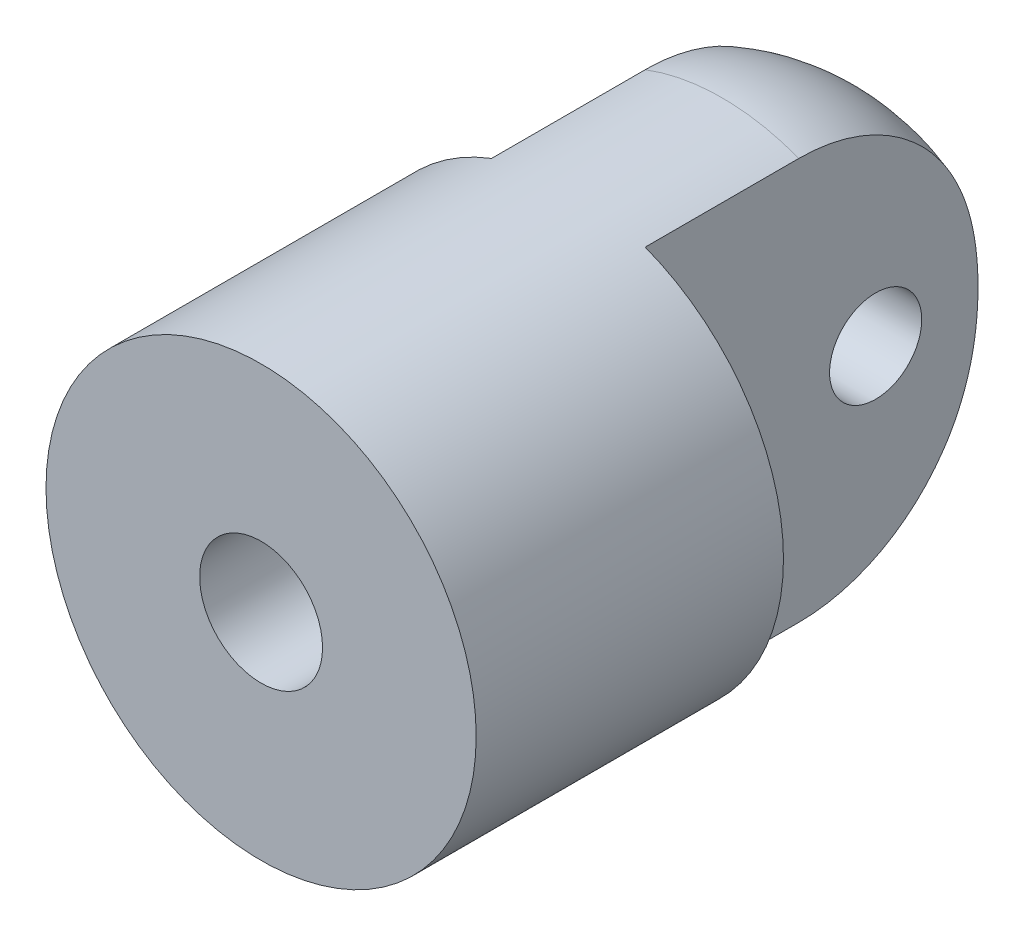
ISO-10303-21;
HEADER;
FILE_DESCRIPTION(('STEP AP214'),'2;1');
FILE_NAME('part.step','',(''),(''),'','','');
FILE_SCHEMA(('AUTOMOTIVE_DESIGN { 1 0 10303 214 1 1 1 1 }'));
ENDSEC;
DATA;
#1=APPLICATION_CONTEXT('core data for automotive mechanical design processes');
#2=APPLICATION_PROTOCOL_DEFINITION('international standard','automotive_design',2000,#1);
#3=PRODUCT_CONTEXT('',#1,'mechanical');
#4=PRODUCT('Part','Part','',(#3));
#5=PRODUCT_RELATED_PRODUCT_CATEGORY('part','',(#4));
#6=PRODUCT_DEFINITION_FORMATION('','',#4);
#7=PRODUCT_DEFINITION_CONTEXT('part definition',#1,'design');
#8=PRODUCT_DEFINITION('design','',#6,#7);
#9=PRODUCT_DEFINITION_SHAPE('','',#8);
#10=(LENGTH_UNIT() NAMED_UNIT(*) SI_UNIT(.MILLI.,.METRE.));
#11=(NAMED_UNIT(*) PLANE_ANGLE_UNIT() SI_UNIT($,.RADIAN.));
#12=(NAMED_UNIT(*) SI_UNIT($,.STERADIAN.) SOLID_ANGLE_UNIT());
#13=UNCERTAINTY_MEASURE_WITH_UNIT(LENGTH_MEASURE(1.E-05),#10,'distance_accuracy_value','');
#14=(GEOMETRIC_REPRESENTATION_CONTEXT(3) GLOBAL_UNCERTAINTY_ASSIGNED_CONTEXT((#13)) GLOBAL_UNIT_ASSIGNED_CONTEXT((#10,
#11,#12)) REPRESENTATION_CONTEXT('',''));
#15=CARTESIAN_POINT('',(0.,0.,0.));
#16=DIRECTION('',(0.,0.,1.));
#17=DIRECTION('',(1.,0.,0.));
#18=AXIS2_PLACEMENT_3D('',#15,#16,#17);
#19=CARTESIAN_POINT('',(0.,0.,0.));
#20=DIRECTION('',(0.,0.,-1.));
#21=DIRECTION('',(-1.,0.,0.));
#22=AXIS2_PLACEMENT_3D('',#19,#20,#21);
#23=PLANE('',#22);
#24=CARTESIAN_POINT('',(0.,0.,0.));
#25=DIRECTION('',(0.,0.,1.));
#26=DIRECTION('',(1.,0.,0.));
#27=AXIS2_PLACEMENT_3D('',#24,#25,#26);
#28=CIRCLE('',#27,4.);
#29=CARTESIAN_POINT('',(4.,0.,0.));
#30=VERTEX_POINT('',#29);
#31=EDGE_CURVE('E99',#30,#30,#28,.T.);
#32=ORIENTED_EDGE('',*,*,#31,.F.);
#33=EDGE_LOOP('',(#32));
#34=FACE_BOUND('',#33,.T.);
#35=CARTESIAN_POINT('',(0.,0.,0.));
#36=DIRECTION('',(0.,0.,1.));
#37=DIRECTION('',(1.,0.,0.));
#38=AXIS2_PLACEMENT_3D('',#35,#36,#37);
#39=CIRCLE('',#38,14.);
#40=CARTESIAN_POINT('',(14.,0.,0.));
#41=VERTEX_POINT('',#40);
#42=EDGE_CURVE('E106',#41,#41,#39,.T.);
#43=ORIENTED_EDGE('',*,*,#42,.T.);
#44=EDGE_LOOP('',(#43));
#45=FACE_BOUND('',#44,.T.);
#46=ADVANCED_FACE('F32',(#34,#45),#23,.F.);
#47=CARTESIAN_POINT('',(0.,0.,8.75383237650706));
#48=DIRECTION('',(0.,0.,1.));
#49=DIRECTION('',(1.,0.,0.));
#50=AXIS2_PLACEMENT_3D('',#47,#48,#49);
#51=CYLINDRICAL_SURFACE('',#50,14.);
#52=CARTESIAN_POINT('',(0.,0.,-30.));
#53=DIRECTION('',(0.,0.,1.));
#54=DIRECTION('',(1.,0.,0.));
#55=AXIS2_PLACEMENT_3D('',#52,#53,#54);
#56=CIRCLE('',#55,14.);
#57=CARTESIAN_POINT('',(-5.,-13.076696830622,-30.));
#58=VERTEX_POINT('',#57);
#59=CARTESIAN_POINT('',(5.,-13.076696830622,-30.));
#60=VERTEX_POINT('',#59);
#61=EDGE_CURVE('E88',#58,#60,#56,.T.);
#62=ORIENTED_EDGE('',*,*,#61,.T.);
#63=DIRECTION('',(0.,0.,1.));
#64=VECTOR('',#63,1.);
#65=CARTESIAN_POINT('',(5.,-13.076696830622,8.75383237650706));
#66=LINE('',#65,#64);
#67=CARTESIAN_POINT('',(5.,-13.076696830622,-20.));
#68=VERTEX_POINT('',#67);
#69=EDGE_CURVE('E46',#60,#68,#66,.T.);
#70=ORIENTED_EDGE('',*,*,#69,.T.);
#71=CARTESIAN_POINT('',(0.,0.,-20.));
#72=DIRECTION('',(0.,0.,1.));
#73=DIRECTION('',(1.,0.,0.));
#74=AXIS2_PLACEMENT_3D('',#71,#72,#73);
#75=CIRCLE('',#74,14.);
#76=CARTESIAN_POINT('',(5.,13.076696830622,-20.));
#77=VERTEX_POINT('',#76);
#78=EDGE_CURVE('E11',#68,#77,#75,.T.);
#79=ORIENTED_EDGE('',*,*,#78,.T.);
#80=DIRECTION('',(0.,0.,1.));
#81=VECTOR('',#80,1.);
#82=CARTESIAN_POINT('',(5.,13.076696830622,8.75383237650706));
#83=LINE('',#82,#81);
#84=CARTESIAN_POINT('',(5.,13.076696830622,-30.));
#85=VERTEX_POINT('',#84);
#86=EDGE_CURVE('E80',#77,#85,#83,.F.);
#87=ORIENTED_EDGE('',*,*,#86,.T.);
#88=CARTESIAN_POINT('',(-5.,13.076696830622,-30.));
#89=VERTEX_POINT('',#88);
#90=EDGE_CURVE('E54',#85,#89,#56,.T.);
#91=ORIENTED_EDGE('',*,*,#90,.T.);
#92=DIRECTION('',(0.,0.,1.));
#93=VECTOR('',#92,1.);
#94=CARTESIAN_POINT('',(-4.99999999999999,13.076696830622,8.75383237650706));
#95=LINE('',#94,#93);
#96=CARTESIAN_POINT('',(-5.,13.076696830622,-20.));
#97=VERTEX_POINT('',#96);
#98=EDGE_CURVE('E97',#89,#97,#95,.T.);
#99=ORIENTED_EDGE('',*,*,#98,.T.);
#100=CARTESIAN_POINT('',(0.,0.,-20.));
#101=DIRECTION('',(0.,0.,1.));
#102=DIRECTION('',(1.,0.,0.));
#103=AXIS2_PLACEMENT_3D('',#100,#101,#102);
#104=CIRCLE('',#103,14.);
#105=CARTESIAN_POINT('',(-5.,-13.076696830622,-20.));
#106=VERTEX_POINT('',#105);
#107=EDGE_CURVE('E116',#97,#106,#104,.T.);
#108=ORIENTED_EDGE('',*,*,#107,.T.);
#109=DIRECTION('',(0.,0.,1.));
#110=VECTOR('',#109,1.);
#111=CARTESIAN_POINT('',(-4.99999999999999,-13.076696830622,8.75383237650706));
#112=LINE('',#111,#110);
#113=EDGE_CURVE('E92',#106,#58,#112,.F.);
#114=ORIENTED_EDGE('',*,*,#113,.T.);
#115=EDGE_LOOP('',(#62,#70,#79,#87,#91,#99,#108,#114));
#116=FACE_BOUND('',#115,.T.);
#117=ORIENTED_EDGE('',*,*,#42,.F.);
#118=EDGE_LOOP('',(#117));
#119=FACE_BOUND('',#118,.T.);
#120=ADVANCED_FACE('F84',(#116,#119),#51,.T.);
#121=CARTESIAN_POINT('',(1.94512856266505,0.,-30.));
#122=DIRECTION('',(0.,-1.,0.));
#123=DIRECTION('',(1.,0.,0.));
#124=AXIS2_PLACEMENT_3D('',#121,#122,#123);
#125=CIRCLE('',#124,12.054871437335);
#126=TRIMMED_CURVE('',#125,(PARAMETER_VALUE(-1.73286105969095)),
(PARAMETER_VALUE(1.73286105969095)),.T.,.PARAMETER.);
#127=CARTESIAN_POINT('',(0.,0.,-30.));
#128=DIRECTION('',(0.,0.,1.));
#129=AXIS1_PLACEMENT('',#127,#128);
#130=SURFACE_OF_REVOLUTION('',#126,#129);
#131=ORIENTED_EDGE('',*,*,#90,.F.);
#132=CARTESIAN_POINT('',(5.,0.,-41.6613758138579));
#133=CARTESIAN_POINT('',(5.,-0.215531690753047,-41.6613703526694));
#134=CARTESIAN_POINT('',(5.,-0.431053301046679,-41.657734474861));
#135=CARTESIAN_POINT('',(5.,-0.861843002092462,-41.6430542569786));
#136=CARTESIAN_POINT('',(5.,-1.07711108765809,-41.6320097678913));
#137=CARTESIAN_POINT('',(5.,-1.72214591124911,-41.5872941439153));
#138=CARTESIAN_POINT('',(5.,-2.15119713202942,-41.5420409872187));
#139=CARTESIAN_POINT('',(5.,-3.00302079993997,-41.4168706669944));
#140=CARTESIAN_POINT('',(5.,-3.42580782332994,-41.3370541899313));
#141=CARTESIAN_POINT('',(5.,-4.26233386081906,-41.1391509450518));
#142=CARTESIAN_POINT('',(5.,-4.67607615755018,-41.0210783163501));
#143=CARTESIAN_POINT('',(5.,-5.40460420125067,-40.7736547749251));
#144=CARTESIAN_POINT('',(5.,-5.72196285433124,-40.6518482778642));
#145=CARTESIAN_POINT('',(5.,-6.3457019123643,-40.3828253486696));
#146=CARTESIAN_POINT('',(5.,-6.65208429518977,-40.2356135225529));
#147=CARTESIAN_POINT('',(5.,-7.25162168828341,-39.9159283111742));
#148=CARTESIAN_POINT('',(5.,-7.54476885890042,-39.743440204214));
#149=CARTESIAN_POINT('',(5.,-8.11523301890642,-39.3739845511638));
#150=CARTESIAN_POINT('',(5.,-8.39254981110808,-39.1770167002447));
#151=CARTESIAN_POINT('',(5.,-8.92969970466936,-38.7591839183336));
#152=CARTESIAN_POINT('',(5.,-9.18948674383937,-38.5382597237878));
#153=CARTESIAN_POINT('',(5.,-9.68859487429579,-38.0743717819135));
#154=CARTESIAN_POINT('',(5.,-9.92791566841528,-37.8314077146748));
#155=CARTESIAN_POINT('',(5.,-10.384026276946,-37.3251876627369));
#156=CARTESIAN_POINT('',(5.,-10.6008168472011,-37.0619323592843));
#157=CARTESIAN_POINT('',(5.,-11.010003797244,-36.5171061966088));
#158=CARTESIAN_POINT('',(5.,-11.2024012029604,-36.2355361084237));
#159=CARTESIAN_POINT('',(5.,-11.552304684349,-35.6705463625595));
#160=CARTESIAN_POINT('',(5.,-11.7110626751768,-35.3879011130444));
#161=CARTESIAN_POINT('',(5.,-12.0037958928568,-34.8100586384969));
#162=CARTESIAN_POINT('',(5.,-12.137771852142,-34.5148617847443));
#163=CARTESIAN_POINT('',(5.,-12.3798734309507,-33.9141120795869));
#164=CARTESIAN_POINT('',(5.,-12.4880036085408,-33.608561065072));
#165=CARTESIAN_POINT('',(5.,-12.6775985934255,-32.9892933180596));
#166=CARTESIAN_POINT('',(5.,-12.7590635158512,-32.6755766208248));
#167=CARTESIAN_POINT('',(5.,-12.8934978081768,-32.0478657335448));
#168=CARTESIAN_POINT('',(5.,-12.946942794585,-31.7339733082627));
#169=CARTESIAN_POINT('',(5.,-13.0270778981836,-31.1027941812273));
#170=CARTESIAN_POINT('',(5.,-13.0537683997155,-30.7855075283001));
#171=CARTESIAN_POINT('',(5.,-13.0801935871318,-30.1498106706232));
#172=CARTESIAN_POINT('',(5.,-13.0799279847987,-29.8314004538967));
#173=CARTESIAN_POINT('',(5.,-13.0524423034385,-29.1957450055012));
#174=CARTESIAN_POINT('',(5.,-13.0252222106959,-28.8784997744251));
#175=CARTESIAN_POINT('',(5.,-12.9442208222368,-28.2489067020155));
#176=CARTESIAN_POINT('',(5.,-12.89056250729,-27.9365430291436));
#177=CARTESIAN_POINT('',(5.,-12.7571458166268,-27.3174422382069));
#178=CARTESIAN_POINT('',(5.,-12.6773875711248,-27.0107050920791));
#179=CARTESIAN_POINT('',(5.,-12.4923799990096,-26.4050610485721));
#180=CARTESIAN_POINT('',(5.,-12.387133920041,-26.1061531589665));
#181=CARTESIAN_POINT('',(5.,-12.1519327420199,-25.5182230560611));
#182=CARTESIAN_POINT('',(5.,-12.0219775750435,-25.229200869939));
#183=CARTESIAN_POINT('',(5.,-11.7380379675334,-24.6624685308294));
#184=CARTESIAN_POINT('',(5.,-11.5840046509783,-24.3847828683835));
#185=CARTESIAN_POINT('',(5.,-11.2532586680519,-23.8432676110672));
#186=CARTESIAN_POINT('',(5.,-11.0765460378011,-23.5794379941296));
#187=CARTESIAN_POINT('',(5.,-10.7016948161306,-23.0673200936304));
#188=CARTESIAN_POINT('',(5.,-10.5035483246919,-22.8190375939718));
#189=CARTESIAN_POINT('',(5.,-10.087363529128,-22.3397487341956));
#190=CARTESIAN_POINT('',(5.,-9.86932504202775,-22.1087425330284));
#191=CARTESIAN_POINT('',(5.,-9.41235467386179,-21.6628980954771));
#192=CARTESIAN_POINT('',(5.,-9.17321053557282,-21.4482774503419));
#193=CARTESIAN_POINT('',(5.,-8.67804644081188,-21.0394939159276));
#194=CARTESIAN_POINT('',(5.,-8.42202654246357,-20.8453309561939));
#195=CARTESIAN_POINT('',(5.,-7.89536680352257,-20.4787327905788));
#196=CARTESIAN_POINT('',(5.,-7.62474576594607,-20.3062705501639));
#197=CARTESIAN_POINT('',(5.,-7.07059152240381,-19.9835338648501));
#198=CARTESIAN_POINT('',(5.,-6.78705800711895,-19.8332599518399));
#199=CARTESIAN_POINT('',(5.,-6.19935418546161,-19.5506068181957));
#200=CARTESIAN_POINT('',(5.,-5.8948102176154,-19.4190052321087));
#201=CARTESIAN_POINT('',(5.,-5.2763806596478,-19.1799489672635));
#202=CARTESIAN_POINT('',(5.,-4.96249396021136,-19.0724971690016));
#203=CARTESIAN_POINT('',(5.,-4.32677262283935,-18.8809607068664));
#204=CARTESIAN_POINT('',(5.,-4.00491880975242,-18.7969399327132));
#205=CARTESIAN_POINT('',(5.,-3.35617937595082,-18.651525867384));
#206=CARTESIAN_POINT('',(5.,-3.02929328229742,-18.5901347166545));
#207=CARTESIAN_POINT('',(5.,-2.20325544101001,-18.4620823403864));
#208=CARTESIAN_POINT('',(5.,-1.70196860065263,-18.4089483480779));
#209=CARTESIAN_POINT('',(5.,-0.948118693420843,-18.3605868279737));
#210=CARTESIAN_POINT('',(5.,-0.696376948098759,-18.3496922020193));
#211=CARTESIAN_POINT('',(5.,-0.192638029942362,-18.3379236152167));
#212=CARTESIAN_POINT('',(5.,0.0593591371605929,-18.3370494342909));
#213=CARTESIAN_POINT('',(5.,0.56308868362357,-18.3452774157813));
#214=CARTESIAN_POINT('',(5.,0.814821127399894,-18.3543757618543));
#215=CARTESIAN_POINT('',(5.,1.31771139591604,-18.3829384635765));
#216=CARTESIAN_POINT('',(5.,1.56886921027159,-18.4024030050927));
#217=CARTESIAN_POINT('',(5.,2.06988648543175,-18.4523805889568));
#218=CARTESIAN_POINT('',(5.,2.31974685542566,-18.4828843899962));
#219=CARTESIAN_POINT('',(5.,2.81770727812643,-18.5557465524558));
#220=CARTESIAN_POINT('',(5.,3.06580751885158,-18.5981036275385));
#221=CARTESIAN_POINT('',(5.,3.66233766903785,-18.7157216402738));
#222=CARTESIAN_POINT('',(5.,4.00954589942392,-18.7973399173339));
#223=CARTESIAN_POINT('',(5.,4.69651073486669,-18.9875670834522));
#224=CARTESIAN_POINT('',(5.,5.03626757131908,-19.0961751330745));
#225=CARTESIAN_POINT('',(5.,5.70488782497485,-19.3409706751898));
#226=CARTESIAN_POINT('',(5.,6.03377372979872,-19.4770964697765));
#227=CARTESIAN_POINT('',(5.,6.67862282083423,-19.7771994938975));
#228=CARTESIAN_POINT('',(5.,6.9945857142428,-19.9411773540565));
#229=CARTESIAN_POINT('',(5.,7.61252036981232,-20.2974916653573));
#230=CARTESIAN_POINT('',(5.,7.91440238836135,-20.4899840239321));
#231=CARTESIAN_POINT('',(5.,8.49946473438147,-20.9015933212033));
#232=CARTESIAN_POINT('',(5.,8.78264462331377,-21.1207108838816));
#233=CARTESIAN_POINT('',(5.,9.32794537592781,-21.5843351246839));
#234=CARTESIAN_POINT('',(5.,9.59004282104549,-21.8288693634424));
#235=CARTESIAN_POINT('',(5.,10.0903450773601,-22.3412567418965));
#236=CARTESIAN_POINT('',(5.,10.3285516037366,-22.6091082050164));
#237=CARTESIAN_POINT('',(5.,10.7604508400512,-23.1432245903936));
#238=CARTESIAN_POINT('',(5.,10.956189379955,-23.4078383363474));
#239=CARTESIAN_POINT('',(5.,11.3240456044144,-23.9529990034578));
#240=CARTESIAN_POINT('',(5.,11.4961644633401,-24.2335451314753));
#241=CARTESIAN_POINT('',(5.,11.8152997075368,-24.8083395065434));
#242=CARTESIAN_POINT('',(5.,11.9623316923436,-25.1025790927593));
#243=CARTESIAN_POINT('',(5.,12.2302423336847,-25.7027366854744));
#244=CARTESIAN_POINT('',(5.,12.3511211544351,-26.0086546186309));
#245=CARTESIAN_POINT('',(5.,12.5627487523552,-26.6211709654916));
#246=CARTESIAN_POINT('',(5.,12.6542454124054,-26.9275112397106));
#247=CARTESIAN_POINT('',(5.,12.8109110697857,-27.5468475926082));
#248=CARTESIAN_POINT('',(5.,12.876080674597,-27.8598435175363));
#249=CARTESIAN_POINT('',(5.,12.9796009201105,-28.4902623941225));
#250=CARTESIAN_POINT('',(5.,13.0179496239962,-28.8076856638045));
#251=CARTESIAN_POINT('',(5.,13.0675283617659,-29.4446442740882));
#252=CARTESIAN_POINT('',(5.,13.0787583878027,-29.764179615301));
#253=CARTESIAN_POINT('',(5.,13.0740332652878,-30.4005024057226));
#254=CARTESIAN_POINT('',(5.,13.0582938385031,-30.7172914784741));
#255=CARTESIAN_POINT('',(5.,13.0001610302557,-31.3484125399194));
#256=CARTESIAN_POINT('',(5.,12.9577678478169,-31.6627445469423));
#257=CARTESIAN_POINT('',(5.,12.8466492533139,-32.286697673405));
#258=CARTESIAN_POINT('',(5.,12.7779255261986,-32.5963190929677));
#259=CARTESIAN_POINT('',(5.,12.614660960403,-33.2086783705941));
#260=CARTESIAN_POINT('',(5.,12.5201200743102,-33.5114162160152));
#261=CARTESIAN_POINT('',(5.,12.305945192224,-34.1078317430782));
#262=CARTESIAN_POINT('',(5.,12.186314751136,-34.4015107015068));
#263=CARTESIAN_POINT('',(5.,11.9228490903279,-34.977800001074));
#264=CARTESIAN_POINT('',(5.,11.7790139242482,-35.2604103667402));
#265=CARTESIAN_POINT('',(5.,11.4682082269862,-35.8126226442073));
#266=CARTESIAN_POINT('',(5.,11.3012367100038,-36.0822240010566));
#267=CARTESIAN_POINT('',(5.,10.945410533862,-36.6065743464901));
#268=CARTESIAN_POINT('',(5.,10.7565557584225,-36.8613232561429));
#269=CARTESIAN_POINT('',(5.,10.3569311768215,-37.3560615640834));
#270=CARTESIAN_POINT('',(5.,10.1460128087825,-37.5959309459912));
#271=CARTESIAN_POINT('',(5.,9.70499650642571,-38.0573292008325));
#272=CARTESIAN_POINT('',(5.,9.4748985659694,-38.2788580678959));
#273=CARTESIAN_POINT('',(5.,8.99727515855701,-38.702195220126));
#274=CARTESIAN_POINT('',(5.,8.74975145902217,-38.9040055003221));
#275=CARTESIAN_POINT('',(5.,8.23910225565503,-39.2868008111024));
#276=CARTESIAN_POINT('',(5.,7.97597658599261,-39.4677856202767));
#277=CARTESIAN_POINT('',(5.,7.42980816261734,-39.8120057941604));
#278=CARTESIAN_POINT('',(5.,7.14644524045196,-39.9747329175026));
#279=CARTESIAN_POINT('',(5.,6.56757542771674,-40.2768840283723));
#280=CARTESIAN_POINT('',(5.,6.27206845109418,-40.4163078507372));
#281=CARTESIAN_POINT('',(5.,5.67123094846089,-40.6716066731341));
#282=CARTESIAN_POINT('',(5.,5.36590487542554,-40.7874921781423));
#283=CARTESIAN_POINT('',(5.,4.74746367964721,-40.9960781806901));
#284=CARTESIAN_POINT('',(5.,4.43434846643968,-41.0887784088132));
#285=CARTESIAN_POINT('',(5.,3.78325845652286,-41.2567447425304));
#286=CARTESIAN_POINT('',(5.,3.44492568032114,-41.3306168979023));
#287=CARTESIAN_POINT('',(5.,2.76400766341512,-41.4548463239405));
#288=CARTESIAN_POINT('',(5.,2.42142218925287,-41.5052022977395));
#289=CARTESIAN_POINT('',(5.,1.73293002993424,-41.5846019346046));
#290=CARTESIAN_POINT('',(5.,1.38701698891196,-41.6135893297413));
#291=CARTESIAN_POINT('',(5.,0.694060713360104,-41.6519823853239));
#292=CARTESIAN_POINT('',(5.,0.347017291052062,-41.6613846066568));
#293=CARTESIAN_POINT('',(5.,0.,-41.6613758138579));
#294=B_SPLINE_CURVE_WITH_KNOTS('',3,(#132,#133,#134,#135,#136,#137,#138,#139,#140,#141,#142,
#143,#144,#145,#146,#147,#148,#149,#150,#151,#152,#153,#154,#155,#156,#157,#158,#159,#160,#161,
#162,#163,#164,#165,#166,#167,#168,#169,#170,#171,#172,#173,#174,#175,#176,#177,#178,#179,#180,
#181,#182,#183,#184,#185,#186,#187,#188,#189,#190,#191,#192,#193,#194,#195,#196,#197,#198,#199,
#200,#201,#202,#203,#204,#205,#206,#207,#208,#209,#210,#211,#212,#213,#214,#215,#216,#217,#218,
#219,#220,#221,#222,#223,#224,#225,#226,#227,#228,#229,#230,#231,#232,#233,#234,#235,#236,#237,
#238,#239,#240,#241,#242,#243,#244,#245,#246,#247,#248,#249,#250,#251,#252,#253,#254,#255,#256,
#257,#258,#259,#260,#261,#262,#263,#264,#265,#266,#267,#268,#269,#270,#271,#272,#273,#274,#275,
#276,#277,#278,#279,#280,#281,#282,#283,#284,#285,#286,#287,#288,#289,#290,#291,#292,#293),
.UNSPECIFIED.,.T.,.F.,(4,2,2,2,2,2,2,2,2,2,2,2,2,2,2,2,2,2,2,2,2,2,2,2,2,2,2,2,2,2,2,2,2,2,2,2,
2,2,2,2,2,2,2,2,2,2,2,2,2,2,2,2,2,2,2,2,2,2,2,2,2,2,2,2,2,2,2,2,2,2,2,2,2,2,2,2,2,2,2,2,4),(0.,
0.646539250589783,1.29309150575972,2.58603461777075,3.87523632916226,5.16396210617367,
6.18271302854388,7.20127944380074,8.22044147948488,9.23961620734985,10.261372327361,
11.2831432806048,12.3048799444068,13.3265736217105,14.2979367642917,15.2692711936496,
16.2404341954579,17.2115930040766,18.165684829158,19.1197629480422,20.0738512680351,
21.0279400735059,21.9776321259019,22.9273194402884,23.8768858096904,24.8264547894337,
25.7779769387331,26.7294975725962,27.6813701174155,28.6332514188501,29.5961284742489,
30.5590022134701,31.5206642815063,32.48234939834,33.4765776875618,34.4709245017545,
35.4679566807244,36.4650831408398,37.9750213624368,38.7308194039161,39.4866008458883,
40.242093162092,40.9975990248233,41.7524738875003,42.5072668616157,43.5762214323863,
44.6451427606899,45.7116935109135,46.7782684131344,47.8509063299419,48.9235693896849,
49.9974079749443,51.0711694117894,52.0573850233983,53.0435515826042,54.0291026704104,
55.0146475697485,55.972638941144,56.93060820619,57.8886466418906,58.8466853548146,
59.7970966843857,60.7475009173097,61.6978443419537,62.648189511891,63.5984001195608,
64.548608621488,65.4988576226207,66.4491116732774,67.4062354758425,68.3633595847383,
69.3203867560448,70.27742410122,71.2566296022843,72.2358420431924,73.2146165039729,
74.193402337739,75.2314006080303,76.2694561149584,77.3102353691817,78.3511973665316),.UNSPECIFIED.);
#295=EDGE_CURVE('E39',#85,#60,#294,.T.);
#296=ORIENTED_EDGE('',*,*,#295,.T.);
#297=ORIENTED_EDGE('',*,*,#61,.F.);
#298=CARTESIAN_POINT('',(-5.00000000000001,0.,-41.6613758138579));
#299=CARTESIAN_POINT('',(-5.00000000000001,0.215531690753048,-41.6613703526694));
#300=CARTESIAN_POINT('',(-5.00000000000001,0.43105330104668,-41.657734474861));
#301=CARTESIAN_POINT('',(-5.00000000000001,0.861843002092464,-41.6430542569786));
#302=CARTESIAN_POINT('',(-5.00000000000001,1.07711108765809,-41.6320097678913));
#303=CARTESIAN_POINT('',(-5.00000000000001,1.72214591124911,-41.5872941439153));
#304=CARTESIAN_POINT('',(-5.00000000000001,2.15119713202943,-41.5420409872187));
#305=CARTESIAN_POINT('',(-5.00000000000001,3.00302079993998,-41.4168706669944));
#306=CARTESIAN_POINT('',(-5.00000000000001,3.42580782332995,-41.3370541899313));
#307=CARTESIAN_POINT('',(-5.00000000000001,4.26233386081907,-41.1391509450518));
#308=CARTESIAN_POINT('',(-5.00000000000001,4.67607615755019,-41.02107831635));
#309=CARTESIAN_POINT('',(-5.00000000000001,5.40460420125069,-40.7736547749251));
#310=CARTESIAN_POINT('',(-5.00000000000001,5.72196285433125,-40.6518482778641));
#311=CARTESIAN_POINT('',(-5.00000000000001,6.34570191236431,-40.3828253486696));
#312=CARTESIAN_POINT('',(-5.00000000000001,6.65208429518978,-40.2356135225529));
#313=CARTESIAN_POINT('',(-5.00000000000001,7.25162168828342,-39.9159283111742));
#314=CARTESIAN_POINT('',(-5.00000000000001,7.54476885890042,-39.743440204214));
#315=CARTESIAN_POINT('',(-5.00000000000001,8.11523301890643,-39.3739845511638));
#316=CARTESIAN_POINT('',(-5.00000000000001,8.39254981110809,-39.1770167002447));
#317=CARTESIAN_POINT('',(-5.00000000000001,8.92969970466936,-38.7591839183336));
#318=CARTESIAN_POINT('',(-5.00000000000001,9.18948674383937,-38.5382597237878));
#319=CARTESIAN_POINT('',(-5.00000000000001,9.68859487429579,-38.0743717819135));
#320=CARTESIAN_POINT('',(-5.,9.92791566841528,-37.8314077146748));
#321=CARTESIAN_POINT('',(-5.,10.384026276946,-37.3251876627369));
#322=CARTESIAN_POINT('',(-5.,10.6008168472011,-37.0619323592843));
#323=CARTESIAN_POINT('',(-5.,11.010003797244,-36.5171061966087));
#324=CARTESIAN_POINT('',(-5.,11.2024012029604,-36.2355361084237));
#325=CARTESIAN_POINT('',(-5.,11.552304684349,-35.6705463625595));
#326=CARTESIAN_POINT('',(-5.,11.7110626751768,-35.3879011130444));
#327=CARTESIAN_POINT('',(-5.,12.0037958928568,-34.8100586384968));
#328=CARTESIAN_POINT('',(-5.,12.137771852142,-34.5148617847443));
#329=CARTESIAN_POINT('',(-5.,12.3798734309507,-33.9141120795869));
#330=CARTESIAN_POINT('',(-5.,12.4880036085408,-33.608561065072));
#331=CARTESIAN_POINT('',(-5.,12.6775985934255,-32.9892933180595));
#332=CARTESIAN_POINT('',(-5.,12.7590635158512,-32.6755766208248));
#333=CARTESIAN_POINT('',(-5.,12.8934978081768,-32.0478657335448));
#334=CARTESIAN_POINT('',(-5.,12.946942794585,-31.7339733082626));
#335=CARTESIAN_POINT('',(-5.,13.0270778981836,-31.1027941812273));
#336=CARTESIAN_POINT('',(-5.,13.0537683997155,-30.7855075283001));
#337=CARTESIAN_POINT('',(-5.,13.0801935871318,-30.1498106706232));
#338=CARTESIAN_POINT('',(-5.,13.0799279847987,-29.8314004538967));
#339=CARTESIAN_POINT('',(-5.,13.0524423034385,-29.1957450055012));
#340=CARTESIAN_POINT('',(-5.,13.0252222106958,-28.8784997744251));
#341=CARTESIAN_POINT('',(-5.,12.9442208222368,-28.2489067020155));
#342=CARTESIAN_POINT('',(-5.,12.89056250729,-27.9365430291436));
#343=CARTESIAN_POINT('',(-5.,12.7571458166268,-27.3174422382069));
#344=CARTESIAN_POINT('',(-5.,12.6773875711248,-27.0107050920791));
#345=CARTESIAN_POINT('',(-5.,12.4923799990096,-26.4050610485721));
#346=CARTESIAN_POINT('',(-5.,12.387133920041,-26.1061531589665));
#347=CARTESIAN_POINT('',(-5.,12.1519327420199,-25.5182230560611));
#348=CARTESIAN_POINT('',(-5.,12.0219775750435,-25.229200869939));
#349=CARTESIAN_POINT('',(-5.,11.7380379675334,-24.6624685308294));
#350=CARTESIAN_POINT('',(-5.,11.5840046509783,-24.3847828683835));
#351=CARTESIAN_POINT('',(-5.,11.2532586680519,-23.8432676110672));
#352=CARTESIAN_POINT('',(-5.,11.0765460378011,-23.5794379941296));
#353=CARTESIAN_POINT('',(-5.,10.7016948161306,-23.0673200936304));
#354=CARTESIAN_POINT('',(-5.,10.5035483246918,-22.8190375939718));
#355=CARTESIAN_POINT('',(-5.,10.087363529128,-22.3397487341956));
#356=CARTESIAN_POINT('',(-5.,9.86932504202774,-22.1087425330284));
#357=CARTESIAN_POINT('',(-5.,9.41235467386178,-21.6628980954771));
#358=CARTESIAN_POINT('',(-5.,9.17321053557281,-21.4482774503419));
#359=CARTESIAN_POINT('',(-5.,8.67804644081188,-21.0394939159276));
#360=CARTESIAN_POINT('',(-5.,8.42202654246357,-20.8453309561939));
#361=CARTESIAN_POINT('',(-5.,7.89536680352257,-20.4787327905788));
#362=CARTESIAN_POINT('',(-5.,7.62474576594607,-20.3062705501639));
#363=CARTESIAN_POINT('',(-5.,7.07059152240381,-19.9835338648501));
#364=CARTESIAN_POINT('',(-5.,6.78705800711895,-19.8332599518399));
#365=CARTESIAN_POINT('',(-5.,6.19935418546161,-19.5506068181957));
#366=CARTESIAN_POINT('',(-5.,5.8948102176154,-19.4190052321087));
#367=CARTESIAN_POINT('',(-5.,5.27638065964779,-19.1799489672635));
#368=CARTESIAN_POINT('',(-5.,4.96249396021136,-19.0724971690016));
#369=CARTESIAN_POINT('',(-5.,4.32677262283935,-18.8809607068664));
#370=CARTESIAN_POINT('',(-5.,4.00491880975242,-18.7969399327132));
#371=CARTESIAN_POINT('',(-5.,3.35617937595082,-18.651525867384));
#372=CARTESIAN_POINT('',(-5.,3.02929328229742,-18.5901347166545));
#373=CARTESIAN_POINT('',(-5.,2.20325544101001,-18.4620823403864));
#374=CARTESIAN_POINT('',(-5.,1.70196860065263,-18.4089483480779));
#375=CARTESIAN_POINT('',(-5.,0.948118693420843,-18.3605868279737));
#376=CARTESIAN_POINT('',(-5.,0.696376948098757,-18.3496922020193));
#377=CARTESIAN_POINT('',(-5.,0.192638029942358,-18.3379236152167));
#378=CARTESIAN_POINT('',(-5.,-0.0593591371605965,-18.3370494342909));
#379=CARTESIAN_POINT('',(-5.,-0.563088683623573,-18.3452774157813));
#380=CARTESIAN_POINT('',(-5.,-0.814821127399897,-18.3543757618543));
#381=CARTESIAN_POINT('',(-5.,-1.31771139591604,-18.3829384635765));
#382=CARTESIAN_POINT('',(-5.,-1.56886921027159,-18.4024030050927));
#383=CARTESIAN_POINT('',(-5.,-2.06988648543175,-18.4523805889568));
#384=CARTESIAN_POINT('',(-5.,-2.31974685542566,-18.4828843899962));
#385=CARTESIAN_POINT('',(-5.,-2.81770727812643,-18.5557465524558));
#386=CARTESIAN_POINT('',(-5.,-3.06580751885159,-18.5981036275385));
#387=CARTESIAN_POINT('',(-5.,-3.66233766903786,-18.7157216402738));
#388=CARTESIAN_POINT('',(-5.,-4.00954589942392,-18.7973399173339));
#389=CARTESIAN_POINT('',(-5.,-4.69651073486669,-18.9875670834522));
#390=CARTESIAN_POINT('',(-5.,-5.03626757131909,-19.0961751330745));
#391=CARTESIAN_POINT('',(-5.,-5.70488782497486,-19.3409706751898));
#392=CARTESIAN_POINT('',(-5.,-6.03377372979872,-19.4770964697765));
#393=CARTESIAN_POINT('',(-5.,-6.67862282083424,-19.7771994938975));
#394=CARTESIAN_POINT('',(-5.,-6.99458571424281,-19.9411773540565));
#395=CARTESIAN_POINT('',(-5.,-7.61252036981233,-20.2974916653573));
#396=CARTESIAN_POINT('',(-5.,-7.91440238836137,-20.4899840239321));
#397=CARTESIAN_POINT('',(-5.,-8.49946473438148,-20.9015933212033));
#398=CARTESIAN_POINT('',(-5.,-8.78264462331378,-21.1207108838816));
#399=CARTESIAN_POINT('',(-5.,-9.32794537592781,-21.5843351246839));
#400=CARTESIAN_POINT('',(-5.,-9.5900428210455,-21.8288693634424));
#401=CARTESIAN_POINT('',(-5.,-10.0903450773601,-22.3412567418965));
#402=CARTESIAN_POINT('',(-5.,-10.3285516037366,-22.6091082050165));
#403=CARTESIAN_POINT('',(-5.,-10.7604508400512,-23.1432245903936));
#404=CARTESIAN_POINT('',(-5.,-10.956189379955,-23.4078383363474));
#405=CARTESIAN_POINT('',(-5.,-11.3240456044144,-23.9529990034578));
#406=CARTESIAN_POINT('',(-5.,-11.4961644633401,-24.2335451314754));
#407=CARTESIAN_POINT('',(-5.,-11.8152997075368,-24.8083395065434));
#408=CARTESIAN_POINT('',(-5.,-11.9623316923436,-25.1025790927593));
#409=CARTESIAN_POINT('',(-5.,-12.2302423336847,-25.7027366854744));
#410=CARTESIAN_POINT('',(-5.,-12.3511211544351,-26.0086546186309));
#411=CARTESIAN_POINT('',(-5.,-12.5627487523552,-26.6211709654917));
#412=CARTESIAN_POINT('',(-5.,-12.6542454124054,-26.9275112397106));
#413=CARTESIAN_POINT('',(-5.,-12.8109110697857,-27.5468475926082));
#414=CARTESIAN_POINT('',(-5.,-12.876080674597,-27.8598435175363));
#415=CARTESIAN_POINT('',(-5.,-12.9796009201105,-28.4902623941225));
#416=CARTESIAN_POINT('',(-5.,-13.0179496239962,-28.8076856638045));
#417=CARTESIAN_POINT('',(-5.,-13.0675283617659,-29.4446442740882));
#418=CARTESIAN_POINT('',(-5.,-13.0787583878027,-29.764179615301));
#419=CARTESIAN_POINT('',(-5.,-13.0740332652878,-30.4005024057226));
#420=CARTESIAN_POINT('',(-5.,-13.0582938385031,-30.7172914784741));
#421=CARTESIAN_POINT('',(-5.,-13.0001610302557,-31.3484125399194));
#422=CARTESIAN_POINT('',(-5.,-12.9577678478169,-31.6627445469423));
#423=CARTESIAN_POINT('',(-5.,-12.8466492533139,-32.286697673405));
#424=CARTESIAN_POINT('',(-5.,-12.7779255261986,-32.5963190929677));
#425=CARTESIAN_POINT('',(-5.,-12.614660960403,-33.2086783705941));
#426=CARTESIAN_POINT('',(-5.,-12.5201200743102,-33.5114162160152));
#427=CARTESIAN_POINT('',(-5.,-12.305945192224,-34.1078317430783));
#428=CARTESIAN_POINT('',(-5.,-12.186314751136,-34.4015107015068));
#429=CARTESIAN_POINT('',(-5.,-11.9228490903279,-34.977800001074));
#430=CARTESIAN_POINT('',(-5.,-11.7790139242482,-35.2604103667402));
#431=CARTESIAN_POINT('',(-5.,-11.4682082269862,-35.8126226442073));
#432=CARTESIAN_POINT('',(-5.,-11.3012367100038,-36.0822240010566));
#433=CARTESIAN_POINT('',(-5.,-10.945410533862,-36.6065743464901));
#434=CARTESIAN_POINT('',(-5.,-10.7565557584225,-36.8613232561429));
#435=CARTESIAN_POINT('',(-5.,-10.3569311768215,-37.3560615640834));
#436=CARTESIAN_POINT('',(-5.,-10.1460128087825,-37.5959309459912));
#437=CARTESIAN_POINT('',(-5.,-9.70499650642569,-38.0573292008325));
#438=CARTESIAN_POINT('',(-5.00000000000001,-9.47489856596937,-38.2788580678959));
#439=CARTESIAN_POINT('',(-5.00000000000001,-8.99727515855699,-38.702195220126));
#440=CARTESIAN_POINT('',(-5.00000000000001,-8.74975145902215,-38.9040055003222));
#441=CARTESIAN_POINT('',(-5.00000000000001,-8.23910225565502,-39.2868008111024));
#442=CARTESIAN_POINT('',(-5.00000000000001,-7.9759765859926,-39.4677856202767));
#443=CARTESIAN_POINT('',(-5.00000000000001,-7.42980816261734,-39.8120057941604));
#444=CARTESIAN_POINT('',(-5.00000000000001,-7.14644524045195,-39.9747329175026));
#445=CARTESIAN_POINT('',(-5.00000000000001,-6.56757542771674,-40.2768840283723));
#446=CARTESIAN_POINT('',(-5.00000000000001,-6.27206845109418,-40.4163078507372));
#447=CARTESIAN_POINT('',(-5.00000000000001,-5.67123094846088,-40.6716066731341));
#448=CARTESIAN_POINT('',(-5.00000000000001,-5.36590487542553,-40.7874921781423));
#449=CARTESIAN_POINT('',(-5.00000000000001,-4.74746367964721,-40.9960781806901));
#450=CARTESIAN_POINT('',(-5.00000000000001,-4.43434846643967,-41.0887784088132));
#451=CARTESIAN_POINT('',(-5.00000000000001,-3.78325845652285,-41.2567447425304));
#452=CARTESIAN_POINT('',(-5.00000000000001,-3.44492568032113,-41.3306168979023));
#453=CARTESIAN_POINT('',(-5.00000000000001,-2.76400766341512,-41.4548463239405));
#454=CARTESIAN_POINT('',(-5.00000000000001,-2.42142218925287,-41.5052022977395));
#455=CARTESIAN_POINT('',(-5.00000000000001,-1.73293002993424,-41.5846019346046));
#456=CARTESIAN_POINT('',(-5.00000000000001,-1.38701698891196,-41.6135893297413));
#457=CARTESIAN_POINT('',(-5.00000000000001,-0.694060713360103,-41.6519823853239));
#458=CARTESIAN_POINT('',(-5.00000000000001,-0.347017291052062,-41.6613846066568));
#459=CARTESIAN_POINT('',(-5.00000000000001,0.,-41.6613758138579));
#460=B_SPLINE_CURVE_WITH_KNOTS('',3,(#298,#299,#300,#301,#302,#303,#304,#305,#306,#307,#308,
#309,#310,#311,#312,#313,#314,#315,#316,#317,#318,#319,#320,#321,#322,#323,#324,#325,#326,#327,
#328,#329,#330,#331,#332,#333,#334,#335,#336,#337,#338,#339,#340,#341,#342,#343,#344,#345,#346,
#347,#348,#349,#350,#351,#352,#353,#354,#355,#356,#357,#358,#359,#360,#361,#362,#363,#364,#365,
#366,#367,#368,#369,#370,#371,#372,#373,#374,#375,#376,#377,#378,#379,#380,#381,#382,#383,#384,
#385,#386,#387,#388,#389,#390,#391,#392,#393,#394,#395,#396,#397,#398,#399,#400,#401,#402,#403,
#404,#405,#406,#407,#408,#409,#410,#411,#412,#413,#414,#415,#416,#417,#418,#419,#420,#421,#422,
#423,#424,#425,#426,#427,#428,#429,#430,#431,#432,#433,#434,#435,#436,#437,#438,#439,#440,#441,
#442,#443,#444,#445,#446,#447,#448,#449,#450,#451,#452,#453,#454,#455,#456,#457,#458,#459),
.UNSPECIFIED.,.T.,.F.,(4,2,2,2,2,2,2,2,2,2,2,2,2,2,2,2,2,2,2,2,2,2,2,2,2,2,2,2,2,2,2,2,2,2,2,2,
2,2,2,2,2,2,2,2,2,2,2,2,2,2,2,2,2,2,2,2,2,2,2,2,2,2,2,2,2,2,2,2,2,2,2,2,2,2,2,2,2,2,2,2,4),(0.,
0.646539250589784,1.29309150575972,2.58603461777075,3.87523632916227,5.16396210617369,
6.1827130285439,7.20127944380075,8.2204414794849,9.23961620734986,10.261372327361,
11.2831432806048,12.3048799444068,13.3265736217105,14.2979367642917,15.2692711936497,
16.2404341954579,17.2115930040766,18.165684829158,19.1197629480422,20.0738512680351,
21.0279400735059,21.9776321259019,22.9273194402884,23.8768858096904,24.8264547894337,
25.7779769387331,26.7294975725962,27.6813701174156,28.6332514188502,29.5961284742489,
30.5590022134701,31.5206642815063,32.48234939834,33.4765776875618,34.4709245017545,
35.4679566807244,36.4650831408398,37.9750213624368,38.730819403916,39.4866008458883,
40.242093162092,40.9975990248233,41.7524738875003,42.5072668616157,43.5762214323863,
44.6451427606899,45.7116935109135,46.7782684131344,47.8509063299419,48.9235693896849,
49.9974079749443,51.0711694117894,52.0573850233983,53.0435515826042,54.0291026704104,
55.0146475697485,55.972638941144,56.93060820619,57.8886466418906,58.8466853548146,
59.7970966843857,60.7475009173097,61.6978443419537,62.648189511891,63.5984001195608,
64.548608621488,65.4988576226207,66.4491116732774,67.4062354758425,68.3633595847383,
69.3203867560448,70.27742410122,71.2566296022842,72.2358420431924,73.2146165039729,
74.193402337739,75.2314006080303,76.2694561149584,77.3102353691816,78.3511973665315),.UNSPECIFIED.);
#461=EDGE_CURVE('E109',#58,#89,#460,.T.);
#462=ORIENTED_EDGE('',*,*,#461,.T.);
#463=EDGE_LOOP('',(#131,#296,#297,#462));
#464=FACE_BOUND('',#463,.T.);
#465=CARTESIAN_POINT('',(0.,0.,-41.8969071714197));
#466=VERTEX_POINT('',#465);
#467=VERTEX_LOOP('',#466);
#468=FACE_BOUND('',#467,.T.);
#469=ADVANCED_FACE('F117',(#464,#468),#130,.T.);
#470=CARTESIAN_POINT('',(0.,0.,-30.));
#471=DIRECTION('',(0.,0.,1.));
#472=DIRECTION('',(1.,0.,0.));
#473=AXIS2_PLACEMENT_3D('',#470,#471,#472);
#474=CYLINDRICAL_SURFACE('',#473,4.);
#475=CARTESIAN_POINT('',(0.,0.,-30.));
#476=DIRECTION('',(0.,0.,1.));
#477=DIRECTION('',(1.,0.,0.));
#478=AXIS2_PLACEMENT_3D('',#475,#476,#477);
#479=CIRCLE('',#478,4.);
#480=CARTESIAN_POINT('',(4.,0.,-30.));
#481=VERTEX_POINT('',#480);
#482=EDGE_CURVE('E100',#481,#481,#479,.T.);
#483=ORIENTED_EDGE('',*,*,#482,.F.);
#484=EDGE_LOOP('',(#483));
#485=FACE_BOUND('',#484,.T.);
#486=ORIENTED_EDGE('',*,*,#31,.T.);
#487=EDGE_LOOP('',(#486));
#488=FACE_BOUND('',#487,.T.);
#489=ADVANCED_FACE('F134',(#485,#488),#474,.F.);
#490=CARTESIAN_POINT('',(0.,0.,-30.));
#491=DIRECTION('',(0.,0.,1.));
#492=DIRECTION('',(1.,0.,0.));
#493=AXIS2_PLACEMENT_3D('',#490,#491,#492);
#494=PLANE('',#493);
#495=ORIENTED_EDGE('',*,*,#482,.T.);
#496=EDGE_LOOP('',(#495));
#497=FACE_BOUND('',#496,.T.);
#498=ADVANCED_FACE('F131',(#497),#494,.T.);
#499=CARTESIAN_POINT('',(-24.1260950859322,-15.,-20.));
#500=DIRECTION('',(0.,0.,1.));
#501=DIRECTION('',(1.,0.,0.));
#502=AXIS2_PLACEMENT_3D('',#499,#500,#501);
#503=PLANE('',#502);
#504=DIRECTION('',(0.,1.,0.));
#505=VECTOR('',#504,1.);
#506=CARTESIAN_POINT('',(-5.,-15.,-20.));
#507=LINE('',#506,#505);
#508=EDGE_CURVE('E89',#106,#97,#507,.T.);
#509=ORIENTED_EDGE('',*,*,#508,.F.);
#510=ORIENTED_EDGE('',*,*,#107,.F.);
#511=EDGE_LOOP('',(#509,#510));
#512=FACE_BOUND('',#511,.T.);
#513=ADVANCED_FACE('F125',(#512),#503,.F.);
#514=CARTESIAN_POINT('',(-5.00000000000001,-15.,-52.2534845059113));
#515=DIRECTION('',(1.,0.,0.));
#516=DIRECTION('',(0.,0.,-1.));
#517=AXIS2_PLACEMENT_3D('',#514,#515,#516);
#518=PLANE('',#517);
#519=CARTESIAN_POINT('',(-5.,0.,-35.));
#520=DIRECTION('',(1.,0.,0.));
#521=DIRECTION('',(0.,0.,-1.));
#522=AXIS2_PLACEMENT_3D('',#519,#520,#521);
#523=CIRCLE('',#522,3.);
#524=CARTESIAN_POINT('',(-5.00000000000001,0.,-38.));
#525=VERTEX_POINT('',#524);
#526=EDGE_CURVE('E81',#525,#525,#523,.T.);
#527=ORIENTED_EDGE('',*,*,#526,.T.);
#528=EDGE_LOOP('',(#527));
#529=FACE_BOUND('',#528,.T.);
#530=ORIENTED_EDGE('',*,*,#461,.F.);
#531=ORIENTED_EDGE('',*,*,#113,.F.);
#532=ORIENTED_EDGE('',*,*,#508,.T.);
#533=ORIENTED_EDGE('',*,*,#98,.F.);
#534=EDGE_LOOP('',(#530,#531,#532,#533));
#535=FACE_BOUND('',#534,.T.);
#536=ADVANCED_FACE('F120',(#529,#535),#518,.F.);
#537=CARTESIAN_POINT('',(5.,-15.,-20.));
#538=DIRECTION('',(0.,0.,1.));
#539=DIRECTION('',(1.,0.,0.));
#540=AXIS2_PLACEMENT_3D('',#537,#538,#539);
#541=PLANE('',#540);
#542=DIRECTION('',(0.,1.,0.));
#543=VECTOR('',#542,1.);
#544=CARTESIAN_POINT('',(5.,-15.,-20.));
#545=LINE('',#544,#543);
#546=EDGE_CURVE('E78',#68,#77,#545,.T.);
#547=ORIENTED_EDGE('',*,*,#546,.T.);
#548=ORIENTED_EDGE('',*,*,#78,.F.);
#549=EDGE_LOOP('',(#547,#548));
#550=FACE_BOUND('',#549,.T.);
#551=ADVANCED_FACE('F77',(#550),#541,.F.);
#552=CARTESIAN_POINT('',(4.99999999999999,-15.,-45.8162131855696));
#553=DIRECTION('',(-1.,0.,0.));
#554=DIRECTION('',(0.,0.,1.));
#555=AXIS2_PLACEMENT_3D('',#552,#553,#554);
#556=PLANE('',#555);
#557=CARTESIAN_POINT('',(5.,0.,-35.));
#558=DIRECTION('',(1.,0.,0.));
#559=DIRECTION('',(0.,0.,-1.));
#560=AXIS2_PLACEMENT_3D('',#557,#558,#559);
#561=CIRCLE('',#560,3.);
#562=CARTESIAN_POINT('',(5.,0.,-38.));
#563=VERTEX_POINT('',#562);
#564=EDGE_CURVE('E205',#563,#563,#561,.T.);
#565=ORIENTED_EDGE('',*,*,#564,.F.);
#566=EDGE_LOOP('',(#565));
#567=FACE_BOUND('',#566,.T.);
#568=ORIENTED_EDGE('',*,*,#295,.F.);
#569=ORIENTED_EDGE('',*,*,#86,.F.);
#570=ORIENTED_EDGE('',*,*,#546,.F.);
#571=ORIENTED_EDGE('',*,*,#69,.F.);
#572=EDGE_LOOP('',(#568,#569,#570,#571));
#573=FACE_BOUND('',#572,.T.);
#574=ADVANCED_FACE('F79',(#567,#573),#556,.F.);
#575=CARTESIAN_POINT('',(-25.,0.,-35.));
#576=DIRECTION('',(1.,0.,0.));
#577=DIRECTION('',(0.,0.,-1.));
#578=AXIS2_PLACEMENT_3D('',#575,#576,#577);
#579=CYLINDRICAL_SURFACE('',#578,3.);
#580=ORIENTED_EDGE('',*,*,#564,.T.);
#581=EDGE_LOOP('',(#580));
#582=FACE_BOUND('',#581,.T.);
#583=ORIENTED_EDGE('',*,*,#526,.F.);
#584=EDGE_LOOP('',(#583));
#585=FACE_BOUND('',#584,.T.);
#586=ADVANCED_FACE('F189',(#582,#585),#579,.F.);
#587=CLOSED_SHELL('',(#46,#120,#469,#489,#498,#513,#536,#551,#574,#586));
#588=MANIFOLD_SOLID_BREP('B2',#587);
#589=ADVANCED_BREP_SHAPE_REPRESENTATION('',(#18,#588),#14);
#590=SHAPE_DEFINITION_REPRESENTATION(#9,#589);
ENDSEC;
END-ISO-10303-21;
